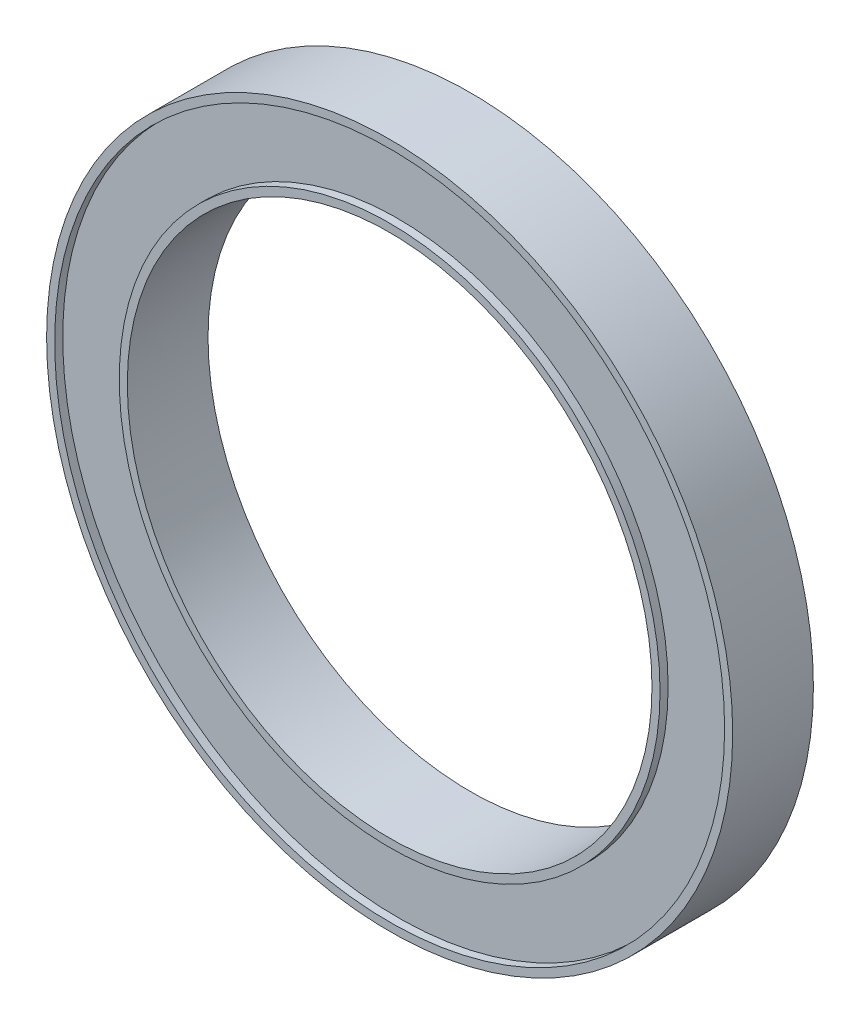
ISO-10303-21;
HEADER;
FILE_DESCRIPTION(('STEP AP214'),'2;1');
FILE_NAME('part.step','',(''),(''),'','','');
FILE_SCHEMA(('AUTOMOTIVE_DESIGN { 1 0 10303 214 1 1 1 1 }'));
ENDSEC;
DATA;
#1=APPLICATION_CONTEXT('core data for automotive mechanical design processes');
#2=APPLICATION_PROTOCOL_DEFINITION('international standard','automotive_design',2000,#1);
#3=PRODUCT_CONTEXT('',#1,'mechanical');
#4=PRODUCT('Part','Part','',(#3));
#5=PRODUCT_RELATED_PRODUCT_CATEGORY('part','',(#4));
#6=PRODUCT_DEFINITION_FORMATION('','',#4);
#7=PRODUCT_DEFINITION_CONTEXT('part definition',#1,'design');
#8=PRODUCT_DEFINITION('design','',#6,#7);
#9=PRODUCT_DEFINITION_SHAPE('','',#8);
#10=(LENGTH_UNIT() NAMED_UNIT(*) SI_UNIT(.MILLI.,.METRE.));
#11=(NAMED_UNIT(*) PLANE_ANGLE_UNIT() SI_UNIT($,.RADIAN.));
#12=(NAMED_UNIT(*) SI_UNIT($,.STERADIAN.) SOLID_ANGLE_UNIT());
#13=UNCERTAINTY_MEASURE_WITH_UNIT(LENGTH_MEASURE(1.E-05),#10,'distance_accuracy_value','');
#14=(GEOMETRIC_REPRESENTATION_CONTEXT(3) GLOBAL_UNCERTAINTY_ASSIGNED_CONTEXT((#13)) GLOBAL_UNIT_ASSIGNED_CONTEXT((#10,
#11,#12)) REPRESENTATION_CONTEXT('',''));
#15=CARTESIAN_POINT('',(0.,0.,0.));
#16=DIRECTION('',(0.,0.,1.));
#17=DIRECTION('',(1.,0.,0.));
#18=AXIS2_PLACEMENT_3D('',#15,#16,#17);
#19=CARTESIAN_POINT('',(0.,0.,-5.));
#20=DIRECTION('',(0.,0.,1.));
#21=DIRECTION('',(1.,0.,0.));
#22=AXIS2_PLACEMENT_3D('',#19,#20,#21);
#23=PLANE('',#22);
#24=CARTESIAN_POINT('',(0.,0.,-5.));
#25=DIRECTION('',(0.,0.,1.));
#26=DIRECTION('',(1.,0.,0.));
#27=AXIS2_PLACEMENT_3D('',#24,#25,#26);
#28=CIRCLE('',#27,32.5);
#29=CARTESIAN_POINT('',(32.5,0.,-5.));
#30=VERTEX_POINT('',#29);
#31=EDGE_CURVE('E56',#30,#30,#28,.T.);
#32=ORIENTED_EDGE('',*,*,#31,.T.);
#33=EDGE_LOOP('',(#32));
#34=FACE_BOUND('',#33,.T.);
#35=CARTESIAN_POINT('',(0.,0.,-5.));
#36=DIRECTION('',(0.,0.,1.));
#37=DIRECTION('',(1.,0.,0.));
#38=AXIS2_PLACEMENT_3D('',#35,#36,#37);
#39=CIRCLE('',#38,33.5);
#40=CARTESIAN_POINT('',(33.5,0.,-5.));
#41=VERTEX_POINT('',#40);
#42=EDGE_CURVE('E80',#41,#41,#39,.T.);
#43=ORIENTED_EDGE('',*,*,#42,.F.);
#44=EDGE_LOOP('',(#43));
#45=FACE_BOUND('',#44,.T.);
#46=ADVANCED_FACE('F43',(#34,#45),#23,.F.);
#47=CARTESIAN_POINT('',(0.,0.,5.));
#48=DIRECTION('',(0.,0.,1.));
#49=DIRECTION('',(1.,0.,0.));
#50=AXIS2_PLACEMENT_3D('',#47,#48,#49);
#51=PLANE('',#50);
#52=CARTESIAN_POINT('',(0.,0.,5.));
#53=DIRECTION('',(0.,0.,1.));
#54=DIRECTION('',(1.,0.,0.));
#55=AXIS2_PLACEMENT_3D('',#52,#53,#54);
#56=CIRCLE('',#55,32.5);
#57=CARTESIAN_POINT('',(32.5,0.,5.));
#58=VERTEX_POINT('',#57);
#59=EDGE_CURVE('E54',#58,#58,#56,.T.);
#60=ORIENTED_EDGE('',*,*,#59,.F.);
#61=EDGE_LOOP('',(#60));
#62=FACE_BOUND('',#61,.T.);
#63=CARTESIAN_POINT('',(0.,0.,5.));
#64=DIRECTION('',(0.,0.,1.));
#65=DIRECTION('',(1.,0.,0.));
#66=AXIS2_PLACEMENT_3D('',#63,#64,#65);
#67=CIRCLE('',#66,33.5);
#68=CARTESIAN_POINT('',(33.5,0.,5.));
#69=VERTEX_POINT('',#68);
#70=EDGE_CURVE('E68',#69,#69,#67,.T.);
#71=ORIENTED_EDGE('',*,*,#70,.T.);
#72=EDGE_LOOP('',(#71));
#73=FACE_BOUND('',#72,.T.);
#74=ADVANCED_FACE('F96',(#62,#73),#51,.T.);
#75=CARTESIAN_POINT('',(0.,0.,5.));
#76=DIRECTION('',(0.,0.,1.));
#77=DIRECTION('',(1.,0.,0.));
#78=AXIS2_PLACEMENT_3D('',#75,#76,#77);
#79=CIRCLE('',#78,41.5);
#80=CARTESIAN_POINT('',(41.5,0.,5.));
#81=VERTEX_POINT('',#80);
#82=EDGE_CURVE('E62',#81,#81,#79,.T.);
#83=ORIENTED_EDGE('',*,*,#82,.F.);
#84=EDGE_LOOP('',(#83));
#85=FACE_BOUND('',#84,.T.);
#86=CARTESIAN_POINT('',(0.,0.,5.));
#87=DIRECTION('',(0.,0.,1.));
#88=DIRECTION('',(1.,0.,0.));
#89=AXIS2_PLACEMENT_3D('',#86,#87,#88);
#90=CIRCLE('',#89,42.5);
#91=CARTESIAN_POINT('',(42.5,0.,5.));
#92=VERTEX_POINT('',#91);
#93=EDGE_CURVE('E10',#92,#92,#90,.T.);
#94=ORIENTED_EDGE('',*,*,#93,.T.);
#95=EDGE_LOOP('',(#94));
#96=FACE_BOUND('',#95,.T.);
#97=ADVANCED_FACE('F104',(#85,#96),#51,.T.);
#98=CARTESIAN_POINT('',(0.,0.,-5.));
#99=DIRECTION('',(0.,0.,1.));
#100=DIRECTION('',(1.,0.,0.));
#101=AXIS2_PLACEMENT_3D('',#98,#99,#100);
#102=CIRCLE('',#101,41.5);
#103=CARTESIAN_POINT('',(41.5,0.,-5.));
#104=VERTEX_POINT('',#103);
#105=EDGE_CURVE('E74',#104,#104,#102,.T.);
#106=ORIENTED_EDGE('',*,*,#105,.T.);
#107=EDGE_LOOP('',(#106));
#108=FACE_BOUND('',#107,.T.);
#109=CARTESIAN_POINT('',(0.,0.,-5.));
#110=DIRECTION('',(0.,0.,1.));
#111=DIRECTION('',(1.,0.,0.));
#112=AXIS2_PLACEMENT_3D('',#109,#110,#111);
#113=CIRCLE('',#112,42.5);
#114=CARTESIAN_POINT('',(42.5,0.,-5.));
#115=VERTEX_POINT('',#114);
#116=EDGE_CURVE('E47',#115,#115,#113,.T.);
#117=ORIENTED_EDGE('',*,*,#116,.F.);
#118=EDGE_LOOP('',(#117));
#119=FACE_BOUND('',#118,.T.);
#120=ADVANCED_FACE('F98',(#108,#119),#23,.F.);
#121=CARTESIAN_POINT('',(0.,0.,5.));
#122=DIRECTION('',(0.,0.,-1.));
#123=DIRECTION('',(-1.,0.,0.));
#124=AXIS2_PLACEMENT_3D('',#121,#122,#123);
#125=CYLINDRICAL_SURFACE('',#124,42.5);
#126=ORIENTED_EDGE('',*,*,#93,.F.);
#127=EDGE_LOOP('',(#126));
#128=FACE_BOUND('',#127,.T.);
#129=ORIENTED_EDGE('',*,*,#116,.T.);
#130=EDGE_LOOP('',(#129));
#131=FACE_BOUND('',#130,.T.);
#132=ADVANCED_FACE('F45',(#128,#131),#125,.T.);
#133=CARTESIAN_POINT('',(0.,0.,5.));
#134=DIRECTION('',(0.,0.,-1.));
#135=DIRECTION('',(-1.,0.,0.));
#136=AXIS2_PLACEMENT_3D('',#133,#134,#135);
#137=CYLINDRICAL_SURFACE('',#136,32.5);
#138=ORIENTED_EDGE('',*,*,#59,.T.);
#139=EDGE_LOOP('',(#138));
#140=FACE_BOUND('',#139,.T.);
#141=ORIENTED_EDGE('',*,*,#31,.F.);
#142=EDGE_LOOP('',(#141));
#143=FACE_BOUND('',#142,.T.);
#144=ADVANCED_FACE('F112',(#140,#143),#137,.F.);
#145=CARTESIAN_POINT('',(0.,0.,4.));
#146=DIRECTION('',(0.,0.,1.));
#147=DIRECTION('',(1.,0.,0.));
#148=AXIS2_PLACEMENT_3D('',#145,#146,#147);
#149=CYLINDRICAL_SURFACE('',#148,41.5);
#150=CARTESIAN_POINT('',(0.,0.,4.));
#151=DIRECTION('',(0.,0.,1.));
#152=DIRECTION('',(1.,0.,0.));
#153=AXIS2_PLACEMENT_3D('',#150,#151,#152);
#154=CIRCLE('',#153,41.5);
#155=CARTESIAN_POINT('',(41.5,0.,4.));
#156=VERTEX_POINT('',#155);
#157=EDGE_CURVE('E59',#156,#156,#154,.T.);
#158=ORIENTED_EDGE('',*,*,#157,.F.);
#159=EDGE_LOOP('',(#158));
#160=FACE_BOUND('',#159,.T.);
#161=ORIENTED_EDGE('',*,*,#82,.T.);
#162=EDGE_LOOP('',(#161));
#163=FACE_BOUND('',#162,.T.);
#164=ADVANCED_FACE('F136',(#160,#163),#149,.F.);
#165=CARTESIAN_POINT('',(0.,0.,4.));
#166=DIRECTION('',(0.,0.,1.));
#167=DIRECTION('',(1.,0.,0.));
#168=AXIS2_PLACEMENT_3D('',#165,#166,#167);
#169=PLANE('',#168);
#170=CARTESIAN_POINT('',(0.,0.,4.));
#171=DIRECTION('',(0.,0.,1.));
#172=DIRECTION('',(1.,0.,0.));
#173=AXIS2_PLACEMENT_3D('',#170,#171,#172);
#174=CIRCLE('',#173,33.5);
#175=CARTESIAN_POINT('',(33.5,0.,4.));
#176=VERTEX_POINT('',#175);
#177=EDGE_CURVE('E65',#176,#176,#174,.T.);
#178=ORIENTED_EDGE('',*,*,#177,.F.);
#179=EDGE_LOOP('',(#178));
#180=FACE_BOUND('',#179,.T.);
#181=ORIENTED_EDGE('',*,*,#157,.T.);
#182=EDGE_LOOP('',(#181));
#183=FACE_BOUND('',#182,.T.);
#184=ADVANCED_FACE('F132',(#180,#183),#169,.T.);
#185=CARTESIAN_POINT('',(0.,0.,4.));
#186=DIRECTION('',(0.,0.,1.));
#187=DIRECTION('',(1.,0.,0.));
#188=AXIS2_PLACEMENT_3D('',#185,#186,#187);
#189=CYLINDRICAL_SURFACE('',#188,33.5);
#190=ORIENTED_EDGE('',*,*,#177,.T.);
#191=EDGE_LOOP('',(#190));
#192=FACE_BOUND('',#191,.T.);
#193=ORIENTED_EDGE('',*,*,#70,.F.);
#194=EDGE_LOOP('',(#193));
#195=FACE_BOUND('',#194,.T.);
#196=ADVANCED_FACE('F127',(#192,#195),#189,.T.);
#197=CARTESIAN_POINT('',(0.,0.,-4.));
#198=DIRECTION('',(0.,0.,-1.));
#199=DIRECTION('',(1.,0.,0.));
#200=AXIS2_PLACEMENT_3D('',#197,#198,#199);
#201=PLANE('',#200);
#202=CARTESIAN_POINT('',(0.,0.,-4.));
#203=DIRECTION('',(0.,0.,1.));
#204=DIRECTION('',(1.,0.,0.));
#205=AXIS2_PLACEMENT_3D('',#202,#203,#204);
#206=CIRCLE('',#205,41.5);
#207=CARTESIAN_POINT('',(41.5,0.,-4.));
#208=VERTEX_POINT('',#207);
#209=EDGE_CURVE('E71',#208,#208,#206,.T.);
#210=ORIENTED_EDGE('',*,*,#209,.F.);
#211=EDGE_LOOP('',(#210));
#212=FACE_BOUND('',#211,.T.);
#213=CARTESIAN_POINT('',(0.,0.,-4.));
#214=DIRECTION('',(0.,0.,1.));
#215=DIRECTION('',(1.,0.,0.));
#216=AXIS2_PLACEMENT_3D('',#213,#214,#215);
#217=CIRCLE('',#216,33.5);
#218=CARTESIAN_POINT('',(33.5,0.,-4.));
#219=VERTEX_POINT('',#218);
#220=EDGE_CURVE('E77',#219,#219,#217,.T.);
#221=ORIENTED_EDGE('',*,*,#220,.T.);
#222=EDGE_LOOP('',(#221));
#223=FACE_BOUND('',#222,.T.);
#224=ADVANCED_FACE('F86',(#212,#223),#201,.T.);
#225=CARTESIAN_POINT('',(0.,0.,-4.));
#226=DIRECTION('',(0.,0.,-1.));
#227=DIRECTION('',(-1.,0.,0.));
#228=AXIS2_PLACEMENT_3D('',#225,#226,#227);
#229=CYLINDRICAL_SURFACE('',#228,41.5);
#230=ORIENTED_EDGE('',*,*,#209,.T.);
#231=EDGE_LOOP('',(#230));
#232=FACE_BOUND('',#231,.T.);
#233=ORIENTED_EDGE('',*,*,#105,.F.);
#234=EDGE_LOOP('',(#233));
#235=FACE_BOUND('',#234,.T.);
#236=ADVANCED_FACE('F91',(#232,#235),#229,.F.);
#237=CARTESIAN_POINT('',(0.,0.,-4.));
#238=DIRECTION('',(0.,0.,-1.));
#239=DIRECTION('',(-1.,0.,0.));
#240=AXIS2_PLACEMENT_3D('',#237,#238,#239);
#241=CYLINDRICAL_SURFACE('',#240,33.5);
#242=ORIENTED_EDGE('',*,*,#220,.F.);
#243=EDGE_LOOP('',(#242));
#244=FACE_BOUND('',#243,.T.);
#245=ORIENTED_EDGE('',*,*,#42,.T.);
#246=EDGE_LOOP('',(#245));
#247=FACE_BOUND('',#246,.T.);
#248=ADVANCED_FACE('F88',(#244,#247),#241,.T.);
#249=CLOSED_SHELL('',(#46,#74,#97,#120,#132,#144,#164,#184,#196,#224,#236,#248));
#250=MANIFOLD_SOLID_BREP('B2',#249);
#251=ADVANCED_BREP_SHAPE_REPRESENTATION('',(#18,#250),#14);
#252=SHAPE_DEFINITION_REPRESENTATION(#9,#251);
ENDSEC;
END-ISO-10303-21;
